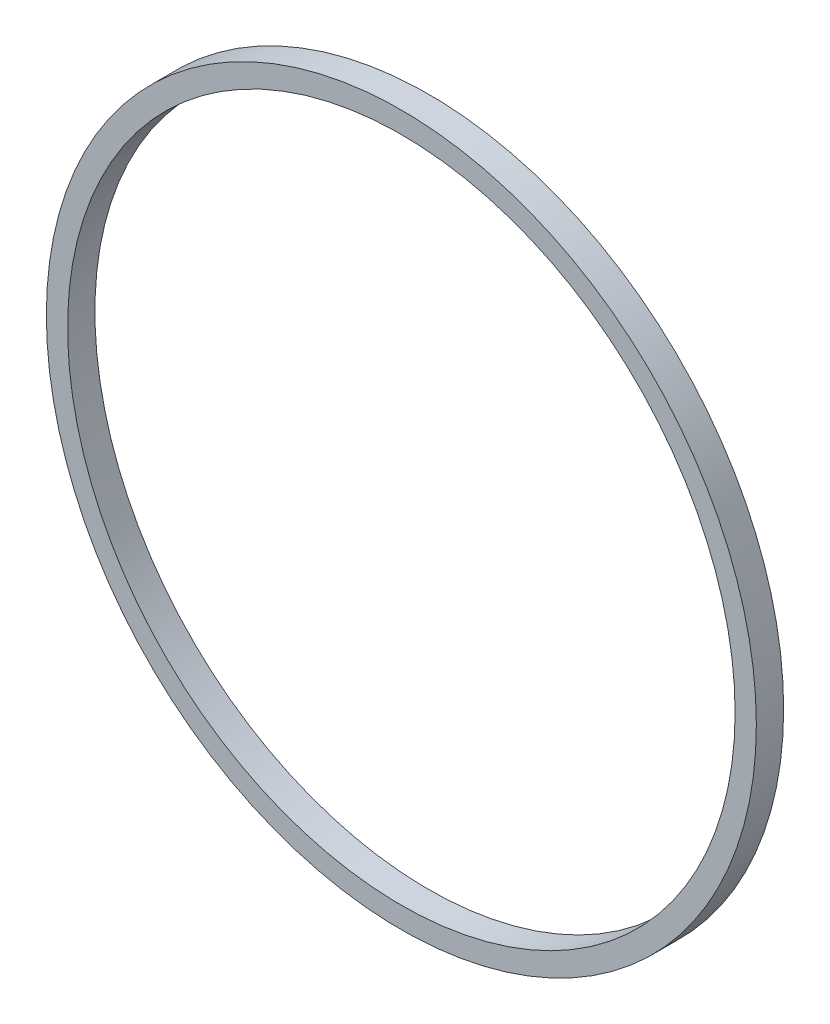
ISO-10303-21;
HEADER;
FILE_DESCRIPTION(('STEP AP214'),'2;1');
FILE_NAME('part.step','',(''),(''),'','','');
FILE_SCHEMA(('AUTOMOTIVE_DESIGN { 1 0 10303 214 1 1 1 1 }'));
ENDSEC;
DATA;
#1=APPLICATION_CONTEXT('core data for automotive mechanical design processes');
#2=APPLICATION_PROTOCOL_DEFINITION('international standard','automotive_design',2000,#1);
#3=PRODUCT_CONTEXT('',#1,'mechanical');
#4=PRODUCT('Part','Part','',(#3));
#5=PRODUCT_RELATED_PRODUCT_CATEGORY('part','',(#4));
#6=PRODUCT_DEFINITION_FORMATION('','',#4);
#7=PRODUCT_DEFINITION_CONTEXT('part definition',#1,'design');
#8=PRODUCT_DEFINITION('design','',#6,#7);
#9=PRODUCT_DEFINITION_SHAPE('','',#8);
#10=(LENGTH_UNIT() NAMED_UNIT(*) SI_UNIT(.MILLI.,.METRE.));
#11=(NAMED_UNIT(*) PLANE_ANGLE_UNIT() SI_UNIT($,.RADIAN.));
#12=(NAMED_UNIT(*) SI_UNIT($,.STERADIAN.) SOLID_ANGLE_UNIT());
#13=UNCERTAINTY_MEASURE_WITH_UNIT(LENGTH_MEASURE(1.E-05),#10,'distance_accuracy_value','');
#14=(GEOMETRIC_REPRESENTATION_CONTEXT(3) GLOBAL_UNCERTAINTY_ASSIGNED_CONTEXT((#13)) GLOBAL_UNIT_ASSIGNED_CONTEXT((#10,
#11,#12)) REPRESENTATION_CONTEXT('',''));
#15=CARTESIAN_POINT('',(0.,0.,0.));
#16=DIRECTION('',(0.,0.,1.));
#17=DIRECTION('',(1.,0.,0.));
#18=AXIS2_PLACEMENT_3D('',#15,#16,#17);
#19=CARTESIAN_POINT('',(70.1311792337728,84.2680326867233,4.5));
#20=DIRECTION('',(0.,0.,-1.));
#21=DIRECTION('',(-1.,0.,0.));
#22=AXIS2_PLACEMENT_3D('',#19,#20,#21);
#23=CYLINDRICAL_SURFACE('',#22,55.);
#24=CARTESIAN_POINT('',(70.1311792337728,84.2680326867233,4.5));
#25=DIRECTION('',(0.,0.,1.));
#26=DIRECTION('',(1.,0.,0.));
#27=AXIS2_PLACEMENT_3D('',#24,#25,#26);
#28=CIRCLE('',#27,55.);
#29=CARTESIAN_POINT('',(125.131179233773,84.2680326867233,4.5));
#30=VERTEX_POINT('',#29);
#31=EDGE_CURVE('E40',#30,#30,#28,.T.);
#32=ORIENTED_EDGE('',*,*,#31,.T.);
#33=EDGE_LOOP('',(#32));
#34=FACE_BOUND('',#33,.T.);
#35=CARTESIAN_POINT('',(70.1311792337728,84.2680326867233,0.));
#36=DIRECTION('',(0.,0.,1.));
#37=DIRECTION('',(1.,0.,0.));
#38=AXIS2_PLACEMENT_3D('',#35,#36,#37);
#39=CIRCLE('',#38,55.);
#40=CARTESIAN_POINT('',(125.131179233773,84.2680326867233,0.));
#41=VERTEX_POINT('',#40);
#42=EDGE_CURVE('E46',#41,#41,#39,.T.);
#43=ORIENTED_EDGE('',*,*,#42,.F.);
#44=EDGE_LOOP('',(#43));
#45=FACE_BOUND('',#44,.T.);
#46=ADVANCED_FACE('F33',(#34,#45),#23,.F.);
#47=CARTESIAN_POINT('',(70.1311792337728,84.2680326867233,4.5));
#48=DIRECTION('',(0.,0.,-1.));
#49=DIRECTION('',(-1.,0.,0.));
#50=AXIS2_PLACEMENT_3D('',#47,#48,#49);
#51=CYLINDRICAL_SURFACE('',#50,58.5);
#52=CARTESIAN_POINT('',(70.1311792337728,84.2680326867233,4.5));
#53=DIRECTION('',(0.,0.,1.));
#54=DIRECTION('',(1.,0.,0.));
#55=AXIS2_PLACEMENT_3D('',#52,#53,#54);
#56=CIRCLE('',#55,58.5);
#57=CARTESIAN_POINT('',(128.631179233773,84.2680326867233,4.5));
#58=VERTEX_POINT('',#57);
#59=EDGE_CURVE('E10',#58,#58,#56,.T.);
#60=ORIENTED_EDGE('',*,*,#59,.F.);
#61=EDGE_LOOP('',(#60));
#62=FACE_BOUND('',#61,.T.);
#63=CARTESIAN_POINT('',(70.1311792337728,84.2680326867233,0.));
#64=DIRECTION('',(0.,0.,1.));
#65=DIRECTION('',(1.,0.,0.));
#66=AXIS2_PLACEMENT_3D('',#63,#64,#65);
#67=CIRCLE('',#66,58.5);
#68=CARTESIAN_POINT('',(128.631179233773,84.2680326867233,0.));
#69=VERTEX_POINT('',#68);
#70=EDGE_CURVE('E36',#69,#69,#67,.T.);
#71=ORIENTED_EDGE('',*,*,#70,.T.);
#72=EDGE_LOOP('',(#71));
#73=FACE_BOUND('',#72,.T.);
#74=ADVANCED_FACE('F53',(#62,#73),#51,.T.);
#75=CARTESIAN_POINT('',(0.,0.,4.5));
#76=DIRECTION('',(0.,0.,1.));
#77=DIRECTION('',(1.,0.,0.));
#78=AXIS2_PLACEMENT_3D('',#75,#76,#77);
#79=PLANE('',#78);
#80=ORIENTED_EDGE('',*,*,#31,.F.);
#81=EDGE_LOOP('',(#80));
#82=FACE_BOUND('',#81,.T.);
#83=ORIENTED_EDGE('',*,*,#59,.T.);
#84=EDGE_LOOP('',(#83));
#85=FACE_BOUND('',#84,.T.);
#86=ADVANCED_FACE('F57',(#82,#85),#79,.T.);
#87=CARTESIAN_POINT('',(0.,0.,0.));
#88=DIRECTION('',(0.,0.,1.));
#89=DIRECTION('',(1.,0.,0.));
#90=AXIS2_PLACEMENT_3D('',#87,#88,#89);
#91=PLANE('',#90);
#92=ORIENTED_EDGE('',*,*,#42,.T.);
#93=EDGE_LOOP('',(#92));
#94=FACE_BOUND('',#93,.T.);
#95=ORIENTED_EDGE('',*,*,#70,.F.);
#96=EDGE_LOOP('',(#95));
#97=FACE_BOUND('',#96,.T.);
#98=ADVANCED_FACE('F55',(#94,#97),#91,.F.);
#99=CLOSED_SHELL('',(#46,#74,#86,#98));
#100=MANIFOLD_SOLID_BREP('B2',#99);
#101=ADVANCED_BREP_SHAPE_REPRESENTATION('',(#18,#100),#14);
#102=SHAPE_DEFINITION_REPRESENTATION(#9,#101);
ENDSEC;
END-ISO-10303-21;
